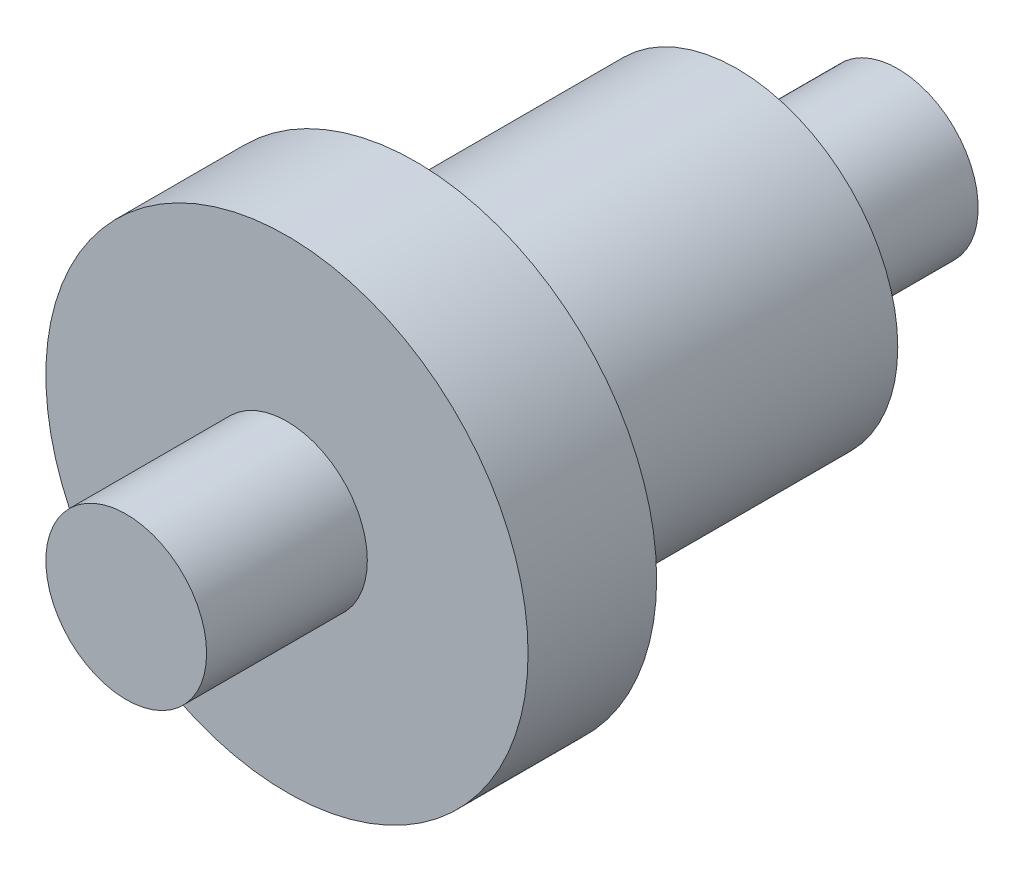
ISO-10303-21;
HEADER;
FILE_DESCRIPTION(('STEP AP214'),'2;1');
FILE_NAME('part.step','',(''),(''),'','','');
FILE_SCHEMA(('AUTOMOTIVE_DESIGN { 1 0 10303 214 1 1 1 1 }'));
ENDSEC;
DATA;
#1=APPLICATION_CONTEXT('core data for automotive mechanical design processes');
#2=APPLICATION_PROTOCOL_DEFINITION('international standard','automotive_design',2000,#1);
#3=PRODUCT_CONTEXT('',#1,'mechanical');
#4=PRODUCT('Part','Part','',(#3));
#5=PRODUCT_RELATED_PRODUCT_CATEGORY('part','',(#4));
#6=PRODUCT_DEFINITION_FORMATION('','',#4);
#7=PRODUCT_DEFINITION_CONTEXT('part definition',#1,'design');
#8=PRODUCT_DEFINITION('design','',#6,#7);
#9=PRODUCT_DEFINITION_SHAPE('','',#8);
#10=(LENGTH_UNIT() NAMED_UNIT(*) SI_UNIT(.MILLI.,.METRE.));
#11=(NAMED_UNIT(*) PLANE_ANGLE_UNIT() SI_UNIT($,.RADIAN.));
#12=(NAMED_UNIT(*) SI_UNIT($,.STERADIAN.) SOLID_ANGLE_UNIT());
#13=UNCERTAINTY_MEASURE_WITH_UNIT(LENGTH_MEASURE(1.E-05),#10,'distance_accuracy_value','');
#14=(GEOMETRIC_REPRESENTATION_CONTEXT(3) GLOBAL_UNCERTAINTY_ASSIGNED_CONTEXT((#13)) GLOBAL_UNIT_ASSIGNED_CONTEXT((#10,
#11,#12)) REPRESENTATION_CONTEXT('',''));
#15=CARTESIAN_POINT('',(0.,0.,0.));
#16=DIRECTION('',(0.,0.,1.));
#17=DIRECTION('',(1.,0.,0.));
#18=AXIS2_PLACEMENT_3D('',#15,#16,#17);
#19=CARTESIAN_POINT('',(0.,0.,5.08));
#20=DIRECTION('',(0.,0.,1.));
#21=DIRECTION('',(1.,0.,0.));
#22=AXIS2_PLACEMENT_3D('',#19,#20,#21);
#23=PLANE('',#22);
#24=CARTESIAN_POINT('',(0.,0.,5.08));
#25=DIRECTION('',(0.,0.,1.));
#26=DIRECTION('',(1.,0.,0.));
#27=AXIS2_PLACEMENT_3D('',#24,#25,#26);
#28=CIRCLE('',#27,9.525);
#29=CARTESIAN_POINT('',(9.525,0.,5.08));
#30=VERTEX_POINT('',#29);
#31=EDGE_CURVE('E39',#30,#30,#28,.T.);
#32=ORIENTED_EDGE('',*,*,#31,.T.);
#33=EDGE_LOOP('',(#32));
#34=FACE_BOUND('',#33,.T.);
#35=CARTESIAN_POINT('',(0.,0.,5.08));
#36=DIRECTION('',(0.,0.,1.));
#37=DIRECTION('',(1.,0.,0.));
#38=AXIS2_PLACEMENT_3D('',#35,#36,#37);
#39=CIRCLE('',#38,3.175);
#40=CARTESIAN_POINT('',(3.175,0.,5.08));
#41=VERTEX_POINT('',#40);
#42=EDGE_CURVE('E59',#41,#41,#39,.T.);
#43=ORIENTED_EDGE('',*,*,#42,.F.);
#44=EDGE_LOOP('',(#43));
#45=FACE_BOUND('',#44,.T.);
#46=ADVANCED_FACE('F32',(#34,#45),#23,.T.);
#47=CARTESIAN_POINT('',(0.,0.,-12.7));
#48=DIRECTION('',(0.,0.,-1.));
#49=DIRECTION('',(-1.,0.,0.));
#50=AXIS2_PLACEMENT_3D('',#47,#48,#49);
#51=PLANE('',#50);
#52=CARTESIAN_POINT('',(0.,0.,-12.7));
#53=DIRECTION('',(0.,0.,-1.));
#54=DIRECTION('',(-1.,0.,0.));
#55=AXIS2_PLACEMENT_3D('',#52,#53,#54);
#56=CIRCLE('',#55,6.35);
#57=CARTESIAN_POINT('',(-6.35,0.,-12.7));
#58=VERTEX_POINT('',#57);
#59=EDGE_CURVE('E48',#58,#58,#56,.T.);
#60=ORIENTED_EDGE('',*,*,#59,.T.);
#61=EDGE_LOOP('',(#60));
#62=FACE_BOUND('',#61,.T.);
#63=CARTESIAN_POINT('',(0.,0.,-12.7));
#64=DIRECTION('',(0.,0.,-1.));
#65=DIRECTION('',(-1.,0.,0.));
#66=AXIS2_PLACEMENT_3D('',#63,#64,#65);
#67=CIRCLE('',#66,3.175);
#68=CARTESIAN_POINT('',(-3.175,0.,-12.7));
#69=VERTEX_POINT('',#68);
#70=EDGE_CURVE('E53',#69,#69,#67,.T.);
#71=ORIENTED_EDGE('',*,*,#70,.F.);
#72=EDGE_LOOP('',(#71));
#73=FACE_BOUND('',#72,.T.);
#74=ADVANCED_FACE('F75',(#62,#73),#51,.T.);
#75=CARTESIAN_POINT('',(0.,0.,0.));
#76=DIRECTION('',(0.,0.,1.));
#77=DIRECTION('',(1.,0.,0.));
#78=AXIS2_PLACEMENT_3D('',#75,#76,#77);
#79=PLANE('',#78);
#80=CARTESIAN_POINT('',(0.,0.,0.));
#81=DIRECTION('',(0.,0.,1.));
#82=DIRECTION('',(1.,0.,0.));
#83=AXIS2_PLACEMENT_3D('',#80,#81,#82);
#84=CIRCLE('',#83,9.525);
#85=CARTESIAN_POINT('',(9.525,0.,0.));
#86=VERTEX_POINT('',#85);
#87=EDGE_CURVE('E43',#86,#86,#84,.T.);
#88=ORIENTED_EDGE('',*,*,#87,.F.);
#89=EDGE_LOOP('',(#88));
#90=FACE_BOUND('',#89,.T.);
#91=CARTESIAN_POINT('',(0.,0.,0.));
#92=DIRECTION('',(0.,0.,1.));
#93=DIRECTION('',(1.,0.,0.));
#94=AXIS2_PLACEMENT_3D('',#91,#92,#93);
#95=CIRCLE('',#94,6.35);
#96=CARTESIAN_POINT('',(6.35,0.,0.));
#97=VERTEX_POINT('',#96);
#98=EDGE_CURVE('E10',#97,#97,#95,.F.);
#99=ORIENTED_EDGE('',*,*,#98,.F.);
#100=EDGE_LOOP('',(#99));
#101=FACE_BOUND('',#100,.T.);
#102=ADVANCED_FACE('F80',(#90,#101),#79,.F.);
#103=CARTESIAN_POINT('',(0.,0.,5.08));
#104=DIRECTION('',(0.,0.,-1.));
#105=DIRECTION('',(-1.,0.,0.));
#106=AXIS2_PLACEMENT_3D('',#103,#104,#105);
#107=CYLINDRICAL_SURFACE('',#106,9.525);
#108=ORIENTED_EDGE('',*,*,#31,.F.);
#109=EDGE_LOOP('',(#108));
#110=FACE_BOUND('',#109,.T.);
#111=ORIENTED_EDGE('',*,*,#87,.T.);
#112=EDGE_LOOP('',(#111));
#113=FACE_BOUND('',#112,.T.);
#114=ADVANCED_FACE('F34',(#110,#113),#107,.T.);
#115=CARTESIAN_POINT('',(0.,0.,-12.7));
#116=DIRECTION('',(0.,0.,1.));
#117=DIRECTION('',(1.,0.,0.));
#118=AXIS2_PLACEMENT_3D('',#115,#116,#117);
#119=CYLINDRICAL_SURFACE('',#118,6.35);
#120=ORIENTED_EDGE('',*,*,#59,.F.);
#121=EDGE_LOOP('',(#120));
#122=FACE_BOUND('',#121,.T.);
#123=ORIENTED_EDGE('',*,*,#98,.T.);
#124=EDGE_LOOP('',(#123));
#125=FACE_BOUND('',#124,.T.);
#126=ADVANCED_FACE('F84',(#122,#125),#119,.T.);
#127=CARTESIAN_POINT('',(0.,0.,-19.05));
#128=DIRECTION('',(0.,0.,1.));
#129=DIRECTION('',(1.,0.,0.));
#130=AXIS2_PLACEMENT_3D('',#127,#128,#129);
#131=CYLINDRICAL_SURFACE('',#130,3.175);
#132=CARTESIAN_POINT('',(0.,0.,-19.05));
#133=DIRECTION('',(0.,0.,-1.));
#134=DIRECTION('',(-1.,0.,0.));
#135=AXIS2_PLACEMENT_3D('',#132,#133,#134);
#136=CIRCLE('',#135,3.175);
#137=CARTESIAN_POINT('',(-3.175,0.,-19.05));
#138=VERTEX_POINT('',#137);
#139=EDGE_CURVE('E52',#138,#138,#136,.T.);
#140=ORIENTED_EDGE('',*,*,#139,.F.);
#141=EDGE_LOOP('',(#140));
#142=FACE_BOUND('',#141,.T.);
#143=ORIENTED_EDGE('',*,*,#70,.T.);
#144=EDGE_LOOP('',(#143));
#145=FACE_BOUND('',#144,.T.);
#146=ADVANCED_FACE('F97',(#142,#145),#131,.T.);
#147=CARTESIAN_POINT('',(0.,0.,-19.05));
#148=DIRECTION('',(0.,0.,-1.));
#149=DIRECTION('',(-1.,0.,0.));
#150=AXIS2_PLACEMENT_3D('',#147,#148,#149);
#151=PLANE('',#150);
#152=ORIENTED_EDGE('',*,*,#139,.T.);
#153=EDGE_LOOP('',(#152));
#154=FACE_BOUND('',#153,.T.);
#155=ADVANCED_FACE('F70',(#154),#151,.T.);
#156=CARTESIAN_POINT('',(0.,0.,11.43));
#157=DIRECTION('',(0.,0.,-1.));
#158=DIRECTION('',(-1.,0.,0.));
#159=AXIS2_PLACEMENT_3D('',#156,#157,#158);
#160=CYLINDRICAL_SURFACE('',#159,3.175);
#161=CARTESIAN_POINT('',(0.,0.,11.43));
#162=DIRECTION('',(0.,0.,1.));
#163=DIRECTION('',(1.,0.,0.));
#164=AXIS2_PLACEMENT_3D('',#161,#162,#163);
#165=CIRCLE('',#164,3.175);
#166=CARTESIAN_POINT('',(3.175,0.,11.43));
#167=VERTEX_POINT('',#166);
#168=EDGE_CURVE('E56',#167,#167,#165,.T.);
#169=ORIENTED_EDGE('',*,*,#168,.F.);
#170=EDGE_LOOP('',(#169));
#171=FACE_BOUND('',#170,.T.);
#172=ORIENTED_EDGE('',*,*,#42,.T.);
#173=EDGE_LOOP('',(#172));
#174=FACE_BOUND('',#173,.T.);
#175=ADVANCED_FACE('F67',(#171,#174),#160,.T.);
#176=CARTESIAN_POINT('',(0.,0.,11.43));
#177=DIRECTION('',(0.,0.,1.));
#178=DIRECTION('',(1.,0.,0.));
#179=AXIS2_PLACEMENT_3D('',#176,#177,#178);
#180=PLANE('',#179);
#181=ORIENTED_EDGE('',*,*,#168,.T.);
#182=EDGE_LOOP('',(#181));
#183=FACE_BOUND('',#182,.T.);
#184=ADVANCED_FACE('F65',(#183),#180,.T.);
#185=CLOSED_SHELL('',(#46,#74,#102,#114,#126,#146,#155,#175,#184));
#186=MANIFOLD_SOLID_BREP('B2',#185);
#187=ADVANCED_BREP_SHAPE_REPRESENTATION('',(#18,#186),#14);
#188=SHAPE_DEFINITION_REPRESENTATION(#9,#187);
ENDSEC;
END-ISO-10303-21;
